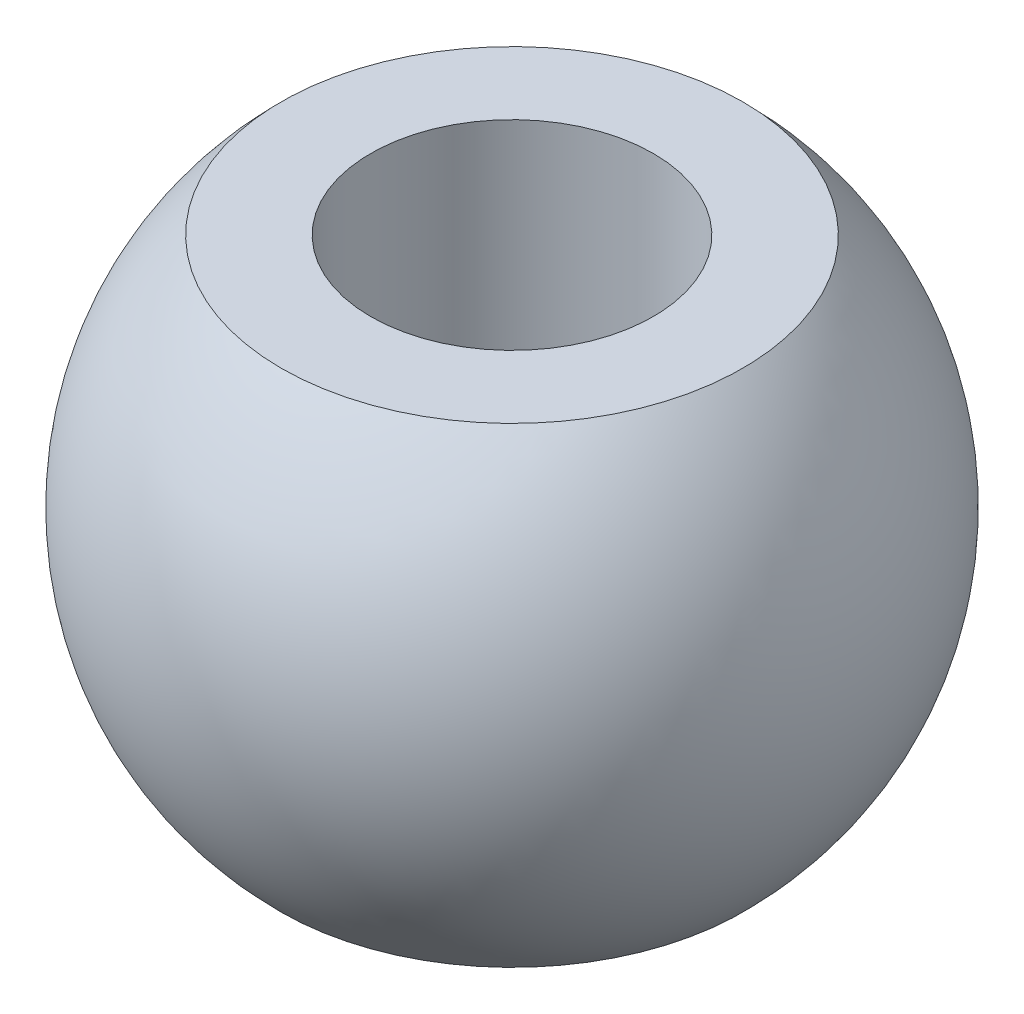
ISO-10303-21;
HEADER;
FILE_DESCRIPTION(('STEP AP214'),'2;1');
FILE_NAME('part.step','',(''),(''),'','','');
FILE_SCHEMA(('AUTOMOTIVE_DESIGN { 1 0 10303 214 1 1 1 1 }'));
ENDSEC;
DATA;
#1=APPLICATION_CONTEXT('core data for automotive mechanical design processes');
#2=APPLICATION_PROTOCOL_DEFINITION('international standard','automotive_design',2000,#1);
#3=PRODUCT_CONTEXT('',#1,'mechanical');
#4=PRODUCT('Part','Part','',(#3));
#5=PRODUCT_RELATED_PRODUCT_CATEGORY('part','',(#4));
#6=PRODUCT_DEFINITION_FORMATION('','',#4);
#7=PRODUCT_DEFINITION_CONTEXT('part definition',#1,'design');
#8=PRODUCT_DEFINITION('design','',#6,#7);
#9=PRODUCT_DEFINITION_SHAPE('','',#8);
#10=(LENGTH_UNIT() NAMED_UNIT(*) SI_UNIT(.MILLI.,.METRE.));
#11=(NAMED_UNIT(*) PLANE_ANGLE_UNIT() SI_UNIT($,.RADIAN.));
#12=(NAMED_UNIT(*) SI_UNIT($,.STERADIAN.) SOLID_ANGLE_UNIT());
#13=UNCERTAINTY_MEASURE_WITH_UNIT(LENGTH_MEASURE(1.E-05),#10,'distance_accuracy_value','');
#14=(GEOMETRIC_REPRESENTATION_CONTEXT(3) GLOBAL_UNCERTAINTY_ASSIGNED_CONTEXT((#13)) GLOBAL_UNIT_ASSIGNED_CONTEXT((#10,
#11,#12)) REPRESENTATION_CONTEXT('',''));
#15=CARTESIAN_POINT('',(0.,0.,0.));
#16=DIRECTION('',(0.,0.,1.));
#17=DIRECTION('',(1.,0.,0.));
#18=AXIS2_PLACEMENT_3D('',#15,#16,#17);
#19=CARTESIAN_POINT('',(0.,0.,0.));
#20=DIRECTION('',(0.,1.,0.));
#21=DIRECTION('',(0.,0.,-1.));
#22=AXIS2_PLACEMENT_3D('',#19,#20,#21);
#23=SPHERICAL_SURFACE('',#22,3.5);
#24=CARTESIAN_POINT('',(0.,0.,0.));
#25=DIRECTION('',(1.,0.,0.));
#26=DIRECTION('',(0.,0.,-1.));
#27=AXIS2_PLACEMENT_3D('',#24,#25,#26);
#28=CIRCLE('',#27,3.5);
#29=CARTESIAN_POINT('',(0.,-2.5,-2.44948974278318));
#30=VERTEX_POINT('',#29);
#31=CARTESIAN_POINT('',(0.,2.5,-2.44948974278318));
#32=VERTEX_POINT('',#31);
#33=EDGE_CURVE('E71',#30,#32,#28,.T.);
#34=ORIENTED_EDGE('',*,*,#33,.T.);
#35=CARTESIAN_POINT('',(0.,2.5,0.));
#36=DIRECTION('',(0.,1.,0.));
#37=DIRECTION('',(0.,0.,-1.));
#38=AXIS2_PLACEMENT_3D('',#35,#36,#37);
#39=CIRCLE('',#38,2.44948974278318);
#40=EDGE_CURVE('E74',#32,#32,#39,.T.);
#41=ORIENTED_EDGE('',*,*,#40,.F.);
#42=ORIENTED_EDGE('',*,*,#33,.F.);
#43=CARTESIAN_POINT('',(0.,-2.5,0.));
#44=DIRECTION('',(0.,1.,0.));
#45=DIRECTION('',(0.,0.,-1.));
#46=AXIS2_PLACEMENT_3D('',#43,#44,#45);
#47=CIRCLE('',#46,2.44948974278318);
#48=EDGE_CURVE('E73',#30,#30,#47,.T.);
#49=ORIENTED_EDGE('',*,*,#48,.T.);
#50=EDGE_LOOP('',(#34,#41,#42,#49));
#51=FACE_BOUND('',#50,.T.);
#52=ADVANCED_FACE('F39',(#51),#23,.T.);
#53=CARTESIAN_POINT('',(0.,2.5,-1.5));
#54=DIRECTION('',(0.,-1.,0.));
#55=DIRECTION('',(0.,0.,-1.));
#56=AXIS2_PLACEMENT_3D('',#53,#54,#55);
#57=PLANE('',#56);
#58=ORIENTED_EDGE('',*,*,#40,.T.);
#59=EDGE_LOOP('',(#58));
#60=FACE_BOUND('',#59,.T.);
#61=CARTESIAN_POINT('',(0.,2.5,0.));
#62=DIRECTION('',(0.,1.,0.));
#63=DIRECTION('',(0.,0.,-1.));
#64=AXIS2_PLACEMENT_3D('',#61,#62,#63);
#65=CIRCLE('',#64,1.5);
#66=CARTESIAN_POINT('',(0.,2.5,-1.5));
#67=VERTEX_POINT('',#66);
#68=EDGE_CURVE('E48',#67,#67,#65,.T.);
#69=ORIENTED_EDGE('',*,*,#68,.F.);
#70=EDGE_LOOP('',(#69));
#71=FACE_BOUND('',#70,.T.);
#72=ADVANCED_FACE('F85',(#60,#71),#57,.F.);
#73=CARTESIAN_POINT('',(0.,0.,0.));
#74=DIRECTION('',(0.,1.,0.));
#75=DIRECTION('',(0.,0.,1.));
#76=AXIS2_PLACEMENT_3D('',#73,#74,#75);
#77=CYLINDRICAL_SURFACE('',#76,1.5);
#78=DIRECTION('',(0.,-1.,0.));
#79=VECTOR('',#78,1.);
#80=CARTESIAN_POINT('',(0.,2.5,-1.5));
#81=LINE('',#80,#79);
#82=CARTESIAN_POINT('',(0.,-2.5,-1.5));
#83=VERTEX_POINT('',#82);
#84=EDGE_CURVE('E55',#67,#83,#81,.T.);
#85=ORIENTED_EDGE('',*,*,#84,.T.);
#86=CARTESIAN_POINT('',(0.,-2.5,0.));
#87=DIRECTION('',(0.,1.,0.));
#88=DIRECTION('',(0.,0.,-1.));
#89=AXIS2_PLACEMENT_3D('',#86,#87,#88);
#90=CIRCLE('',#89,1.5);
#91=EDGE_CURVE('E11',#83,#83,#90,.T.);
#92=ORIENTED_EDGE('',*,*,#91,.F.);
#93=ORIENTED_EDGE('',*,*,#84,.F.);
#94=ORIENTED_EDGE('',*,*,#68,.T.);
#95=EDGE_LOOP('',(#85,#92,#93,#94));
#96=FACE_BOUND('',#95,.T.);
#97=ADVANCED_FACE('F84',(#96),#77,.F.);
#98=CARTESIAN_POINT('',(0.,-2.5,-1.5));
#99=DIRECTION('',(0.,1.,0.));
#100=DIRECTION('',(0.,0.,1.));
#101=AXIS2_PLACEMENT_3D('',#98,#99,#100);
#102=PLANE('',#101);
#103=ORIENTED_EDGE('',*,*,#91,.T.);
#104=EDGE_LOOP('',(#103));
#105=FACE_BOUND('',#104,.T.);
#106=ORIENTED_EDGE('',*,*,#48,.F.);
#107=EDGE_LOOP('',(#106));
#108=FACE_BOUND('',#107,.T.);
#109=ADVANCED_FACE('F41',(#105,#108),#102,.F.);
#110=CLOSED_SHELL('',(#52,#72,#97,#109));
#111=MANIFOLD_SOLID_BREP('B2',#110);
#112=ADVANCED_BREP_SHAPE_REPRESENTATION('',(#18,#111),#14);
#113=SHAPE_DEFINITION_REPRESENTATION(#9,#112);
ENDSEC;
END-ISO-10303-21;
